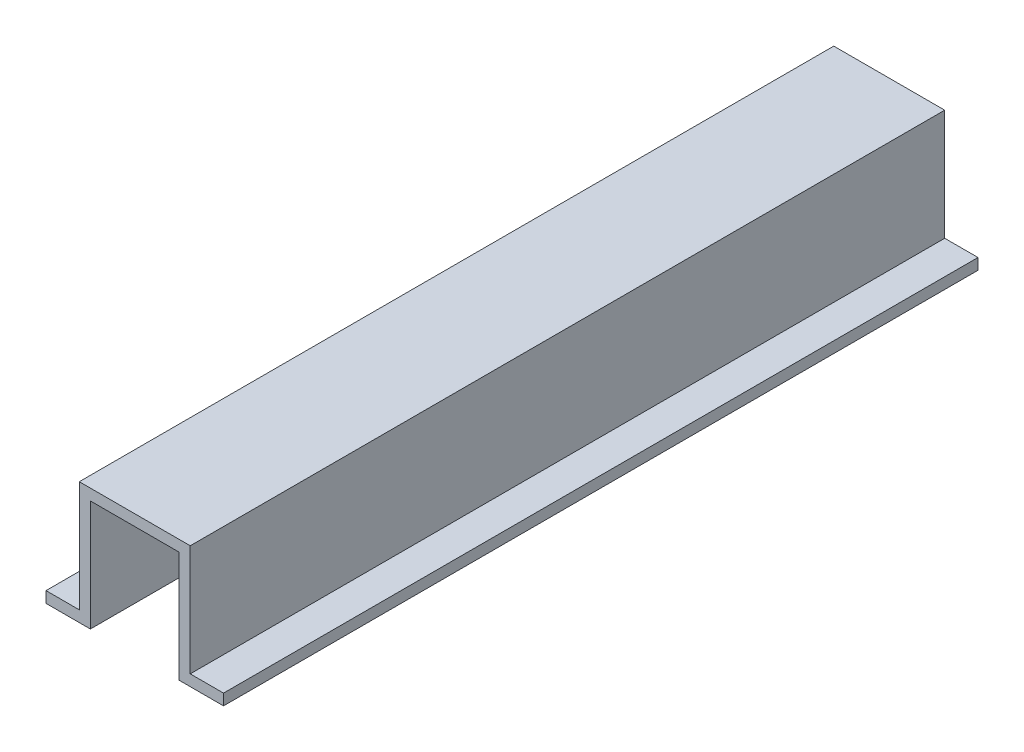
ISO-10303-21;
HEADER;
FILE_DESCRIPTION(('STEP AP214'),'2;1');
FILE_NAME('part.step','',(''),(''),'','','');
FILE_SCHEMA(('AUTOMOTIVE_DESIGN { 1 0 10303 214 1 1 1 1 }'));
ENDSEC;
DATA;
#1=APPLICATION_CONTEXT('core data for automotive mechanical design processes');
#2=APPLICATION_PROTOCOL_DEFINITION('international standard','automotive_design',2000,#1);
#3=PRODUCT_CONTEXT('',#1,'mechanical');
#4=PRODUCT('Part','Part','',(#3));
#5=PRODUCT_RELATED_PRODUCT_CATEGORY('part','',(#4));
#6=PRODUCT_DEFINITION_FORMATION('','',#4);
#7=PRODUCT_DEFINITION_CONTEXT('part definition',#1,'design');
#8=PRODUCT_DEFINITION('design','',#6,#7);
#9=PRODUCT_DEFINITION_SHAPE('','',#8);
#10=(LENGTH_UNIT() NAMED_UNIT(*) SI_UNIT(.MILLI.,.METRE.));
#11=(NAMED_UNIT(*) PLANE_ANGLE_UNIT() SI_UNIT($,.RADIAN.));
#12=(NAMED_UNIT(*) SI_UNIT($,.STERADIAN.) SOLID_ANGLE_UNIT());
#13=UNCERTAINTY_MEASURE_WITH_UNIT(LENGTH_MEASURE(1.E-05),#10,'distance_accuracy_value','');
#14=(GEOMETRIC_REPRESENTATION_CONTEXT(3) GLOBAL_UNCERTAINTY_ASSIGNED_CONTEXT((#13)) GLOBAL_UNIT_ASSIGNED_CONTEXT((#10,
#11,#12)) REPRESENTATION_CONTEXT('',''));
#15=CARTESIAN_POINT('',(0.,0.,0.));
#16=DIRECTION('',(0.,0.,1.));
#17=DIRECTION('',(1.,0.,0.));
#18=AXIS2_PLACEMENT_3D('',#15,#16,#17);
#19=CARTESIAN_POINT('',(-8.,8.,68.));
#20=DIRECTION('',(1.,0.,0.));
#21=DIRECTION('',(0.,0.,-1.));
#22=AXIS2_PLACEMENT_3D('',#19,#20,#21);
#23=PLANE('',#22);
#24=DIRECTION('',(0.,-1.,0.));
#25=VECTOR('',#24,1.);
#26=CARTESIAN_POINT('',(-8.,8.,0.));
#27=LINE('',#26,#25);
#28=CARTESIAN_POINT('',(-8.,8.,0.));
#29=VERTEX_POINT('',#28);
#30=CARTESIAN_POINT('',(-8.,7.,0.));
#31=VERTEX_POINT('',#30);
#32=EDGE_CURVE('E172',#29,#31,#27,.T.);
#33=ORIENTED_EDGE('',*,*,#32,.T.);
#34=DIRECTION('',(0.,0.,-1.));
#35=VECTOR('',#34,1.);
#36=CARTESIAN_POINT('',(-8.,7.,68.));
#37=LINE('',#36,#35);
#38=CARTESIAN_POINT('',(-8.,7.,68.));
#39=VERTEX_POINT('',#38);
#40=EDGE_CURVE('E11',#39,#31,#37,.T.);
#41=ORIENTED_EDGE('',*,*,#40,.F.);
#42=DIRECTION('',(0.,-1.,0.));
#43=VECTOR('',#42,1.);
#44=CARTESIAN_POINT('',(-8.,8.,68.));
#45=LINE('',#44,#43);
#46=CARTESIAN_POINT('',(-8.,8.,68.));
#47=VERTEX_POINT('',#46);
#48=EDGE_CURVE('E206',#47,#39,#45,.T.);
#49=ORIENTED_EDGE('',*,*,#48,.F.);
#50=DIRECTION('',(0.,0.,-1.));
#51=VECTOR('',#50,1.);
#52=CARTESIAN_POINT('',(-8.,8.,68.));
#53=LINE('',#52,#51);
#54=EDGE_CURVE('E168',#47,#29,#53,.T.);
#55=ORIENTED_EDGE('',*,*,#54,.T.);
#56=EDGE_LOOP('',(#33,#41,#49,#55));
#57=FACE_BOUND('',#56,.T.);
#58=ADVANCED_FACE('F45',(#57),#23,.F.);
#59=CARTESIAN_POINT('',(-8.,7.,68.));
#60=DIRECTION('',(0.,1.,0.));
#61=DIRECTION('',(0.,0.,1.));
#62=AXIS2_PLACEMENT_3D('',#59,#60,#61);
#63=PLANE('',#62);
#64=DIRECTION('',(1.,0.,0.));
#65=VECTOR('',#64,1.);
#66=CARTESIAN_POINT('',(-8.,7.,0.));
#67=LINE('',#66,#65);
#68=CARTESIAN_POINT('',(-4.,7.,0.));
#69=VERTEX_POINT('',#68);
#70=EDGE_CURVE('E176',#31,#69,#67,.T.);
#71=ORIENTED_EDGE('',*,*,#70,.T.);
#72=DIRECTION('',(0.,0.,-1.));
#73=VECTOR('',#72,1.);
#74=CARTESIAN_POINT('',(-4.,7.,68.));
#75=LINE('',#74,#73);
#76=CARTESIAN_POINT('',(-4.,7.,68.));
#77=VERTEX_POINT('',#76);
#78=EDGE_CURVE('E54',#77,#69,#75,.T.);
#79=ORIENTED_EDGE('',*,*,#78,.F.);
#80=DIRECTION('',(1.,0.,0.));
#81=VECTOR('',#80,1.);
#82=CARTESIAN_POINT('',(-8.,7.,68.));
#83=LINE('',#82,#81);
#84=EDGE_CURVE('E117',#39,#77,#83,.T.);
#85=ORIENTED_EDGE('',*,*,#84,.F.);
#86=ORIENTED_EDGE('',*,*,#40,.T.);
#87=EDGE_LOOP('',(#71,#79,#85,#86));
#88=FACE_BOUND('',#87,.T.);
#89=ADVANCED_FACE('F282',(#88),#63,.F.);
#90=CARTESIAN_POINT('',(-4.,7.,68.));
#91=DIRECTION('',(-1.,0.,0.));
#92=DIRECTION('',(0.,0.,1.));
#93=AXIS2_PLACEMENT_3D('',#90,#91,#92);
#94=PLANE('',#93);
#95=DIRECTION('',(0.,1.,0.));
#96=VECTOR('',#95,1.);
#97=CARTESIAN_POINT('',(-4.,7.,0.));
#98=LINE('',#97,#96);
#99=CARTESIAN_POINT('',(-4.,17.,0.));
#100=VERTEX_POINT('',#99);
#101=EDGE_CURVE('E179',#69,#100,#98,.T.);
#102=ORIENTED_EDGE('',*,*,#101,.T.);
#103=DIRECTION('',(0.,0.,-1.));
#104=VECTOR('',#103,1.);
#105=CARTESIAN_POINT('',(-4.,17.,68.));
#106=LINE('',#105,#104);
#107=CARTESIAN_POINT('',(-4.,17.,68.));
#108=VERTEX_POINT('',#107);
#109=EDGE_CURVE('E231',#108,#100,#106,.T.);
#110=ORIENTED_EDGE('',*,*,#109,.F.);
#111=DIRECTION('',(0.,1.,0.));
#112=VECTOR('',#111,1.);
#113=CARTESIAN_POINT('',(-4.,7.,68.));
#114=LINE('',#113,#112);
#115=EDGE_CURVE('E241',#77,#108,#114,.T.);
#116=ORIENTED_EDGE('',*,*,#115,.F.);
#117=ORIENTED_EDGE('',*,*,#78,.T.);
#118=EDGE_LOOP('',(#102,#110,#116,#117));
#119=FACE_BOUND('',#118,.T.);
#120=ADVANCED_FACE('F239',(#119),#94,.F.);
#121=CARTESIAN_POINT('',(-4.,17.,68.));
#122=DIRECTION('',(0.,1.,0.));
#123=DIRECTION('',(0.,0.,1.));
#124=AXIS2_PLACEMENT_3D('',#121,#122,#123);
#125=PLANE('',#124);
#126=DIRECTION('',(1.,0.,0.));
#127=VECTOR('',#126,1.);
#128=CARTESIAN_POINT('',(-4.,17.,0.));
#129=LINE('',#128,#127);
#130=CARTESIAN_POINT('',(4.,17.,0.));
#131=VERTEX_POINT('',#130);
#132=EDGE_CURVE('E182',#100,#131,#129,.T.);
#133=ORIENTED_EDGE('',*,*,#132,.T.);
#134=DIRECTION('',(0.,0.,-1.));
#135=VECTOR('',#134,1.);
#136=CARTESIAN_POINT('',(4.,17.,68.));
#137=LINE('',#136,#135);
#138=CARTESIAN_POINT('',(4.,17.,68.));
#139=VERTEX_POINT('',#138);
#140=EDGE_CURVE('E227',#139,#131,#137,.T.);
#141=ORIENTED_EDGE('',*,*,#140,.F.);
#142=DIRECTION('',(1.,0.,0.));
#143=VECTOR('',#142,1.);
#144=CARTESIAN_POINT('',(-4.,17.,68.));
#145=LINE('',#144,#143);
#146=EDGE_CURVE('E260',#108,#139,#145,.T.);
#147=ORIENTED_EDGE('',*,*,#146,.F.);
#148=ORIENTED_EDGE('',*,*,#109,.T.);
#149=EDGE_LOOP('',(#133,#141,#147,#148));
#150=FACE_BOUND('',#149,.T.);
#151=ADVANCED_FACE('F250',(#150),#125,.F.);
#152=CARTESIAN_POINT('',(4.,17.,68.));
#153=DIRECTION('',(1.,0.,0.));
#154=DIRECTION('',(0.,0.,-1.));
#155=AXIS2_PLACEMENT_3D('',#152,#153,#154);
#156=PLANE('',#155);
#157=DIRECTION('',(0.,-1.,0.));
#158=VECTOR('',#157,1.);
#159=CARTESIAN_POINT('',(4.,17.,0.));
#160=LINE('',#159,#158);
#161=CARTESIAN_POINT('',(4.,7.,0.));
#162=VERTEX_POINT('',#161);
#163=EDGE_CURVE('E185',#131,#162,#160,.T.);
#164=ORIENTED_EDGE('',*,*,#163,.T.);
#165=DIRECTION('',(0.,0.,-1.));
#166=VECTOR('',#165,1.);
#167=CARTESIAN_POINT('',(4.,7.,68.));
#168=LINE('',#167,#166);
#169=CARTESIAN_POINT('',(4.,7.,68.));
#170=VERTEX_POINT('',#169);
#171=EDGE_CURVE('E223',#170,#162,#168,.T.);
#172=ORIENTED_EDGE('',*,*,#171,.F.);
#173=DIRECTION('',(0.,-1.,0.));
#174=VECTOR('',#173,1.);
#175=CARTESIAN_POINT('',(4.,17.,68.));
#176=LINE('',#175,#174);
#177=EDGE_CURVE('E256',#139,#170,#176,.T.);
#178=ORIENTED_EDGE('',*,*,#177,.F.);
#179=ORIENTED_EDGE('',*,*,#140,.T.);
#180=EDGE_LOOP('',(#164,#172,#178,#179));
#181=FACE_BOUND('',#180,.T.);
#182=ADVANCED_FACE('F254',(#181),#156,.F.);
#183=CARTESIAN_POINT('',(4.,7.,68.));
#184=DIRECTION('',(0.,1.,0.));
#185=DIRECTION('',(0.,0.,1.));
#186=AXIS2_PLACEMENT_3D('',#183,#184,#185);
#187=PLANE('',#186);
#188=DIRECTION('',(1.,0.,0.));
#189=VECTOR('',#188,1.);
#190=CARTESIAN_POINT('',(4.,7.,0.));
#191=LINE('',#190,#189);
#192=CARTESIAN_POINT('',(8.,7.,0.));
#193=VERTEX_POINT('',#192);
#194=EDGE_CURVE('E188',#162,#193,#191,.T.);
#195=ORIENTED_EDGE('',*,*,#194,.T.);
#196=DIRECTION('',(0.,0.,-1.));
#197=VECTOR('',#196,1.);
#198=CARTESIAN_POINT('',(8.,7.,68.));
#199=LINE('',#198,#197);
#200=CARTESIAN_POINT('',(8.,7.,68.));
#201=VERTEX_POINT('',#200);
#202=EDGE_CURVE('E219',#201,#193,#199,.T.);
#203=ORIENTED_EDGE('',*,*,#202,.F.);
#204=DIRECTION('',(1.,0.,0.));
#205=VECTOR('',#204,1.);
#206=CARTESIAN_POINT('',(4.,7.,68.));
#207=LINE('',#206,#205);
#208=EDGE_CURVE('E259',#170,#201,#207,.T.);
#209=ORIENTED_EDGE('',*,*,#208,.F.);
#210=ORIENTED_EDGE('',*,*,#171,.T.);
#211=EDGE_LOOP('',(#195,#203,#209,#210));
#212=FACE_BOUND('',#211,.T.);
#213=ADVANCED_FACE('F293',(#212),#187,.F.);
#214=CARTESIAN_POINT('',(8.,7.,68.));
#215=DIRECTION('',(-1.,0.,0.));
#216=DIRECTION('',(0.,0.,1.));
#217=AXIS2_PLACEMENT_3D('',#214,#215,#216);
#218=PLANE('',#217);
#219=DIRECTION('',(0.,1.,0.));
#220=VECTOR('',#219,1.);
#221=CARTESIAN_POINT('',(8.,7.,0.));
#222=LINE('',#221,#220);
#223=CARTESIAN_POINT('',(8.,8.,0.));
#224=VERTEX_POINT('',#223);
#225=EDGE_CURVE('E191',#193,#224,#222,.T.);
#226=ORIENTED_EDGE('',*,*,#225,.T.);
#227=DIRECTION('',(0.,0.,-1.));
#228=VECTOR('',#227,1.);
#229=CARTESIAN_POINT('',(8.,8.,68.));
#230=LINE('',#229,#228);
#231=CARTESIAN_POINT('',(8.,8.,68.));
#232=VERTEX_POINT('',#231);
#233=EDGE_CURVE('E215',#232,#224,#230,.T.);
#234=ORIENTED_EDGE('',*,*,#233,.F.);
#235=DIRECTION('',(0.,1.,0.));
#236=VECTOR('',#235,1.);
#237=CARTESIAN_POINT('',(8.,7.,68.));
#238=LINE('',#237,#236);
#239=EDGE_CURVE('E263',#201,#232,#238,.T.);
#240=ORIENTED_EDGE('',*,*,#239,.F.);
#241=ORIENTED_EDGE('',*,*,#202,.T.);
#242=EDGE_LOOP('',(#226,#234,#240,#241));
#243=FACE_BOUND('',#242,.T.);
#244=ADVANCED_FACE('F296',(#243),#218,.F.);
#245=CARTESIAN_POINT('',(8.,8.,68.));
#246=DIRECTION('',(0.,-1.,0.));
#247=DIRECTION('',(0.,0.,-1.));
#248=AXIS2_PLACEMENT_3D('',#245,#246,#247);
#249=PLANE('',#248);
#250=DIRECTION('',(-1.,0.,0.));
#251=VECTOR('',#250,1.);
#252=CARTESIAN_POINT('',(8.,8.,0.));
#253=LINE('',#252,#251);
#254=CARTESIAN_POINT('',(5.,8.,0.));
#255=VERTEX_POINT('',#254);
#256=EDGE_CURVE('E194',#224,#255,#253,.T.);
#257=ORIENTED_EDGE('',*,*,#256,.T.);
#258=DIRECTION('',(0.,0.,-1.));
#259=VECTOR('',#258,1.);
#260=CARTESIAN_POINT('',(5.,8.,68.));
#261=LINE('',#260,#259);
#262=CARTESIAN_POINT('',(5.,8.,68.));
#263=VERTEX_POINT('',#262);
#264=EDGE_CURVE('E212',#263,#255,#261,.T.);
#265=ORIENTED_EDGE('',*,*,#264,.F.);
#266=DIRECTION('',(-1.,0.,0.));
#267=VECTOR('',#266,1.);
#268=CARTESIAN_POINT('',(8.,8.,68.));
#269=LINE('',#268,#267);
#270=EDGE_CURVE('E271',#232,#263,#269,.T.);
#271=ORIENTED_EDGE('',*,*,#270,.F.);
#272=ORIENTED_EDGE('',*,*,#233,.T.);
#273=EDGE_LOOP('',(#257,#265,#271,#272));
#274=FACE_BOUND('',#273,.T.);
#275=ADVANCED_FACE('F300',(#274),#249,.F.);
#276=CARTESIAN_POINT('',(5.,8.,68.));
#277=DIRECTION('',(-1.,0.,0.));
#278=DIRECTION('',(0.,0.,1.));
#279=AXIS2_PLACEMENT_3D('',#276,#277,#278);
#280=PLANE('',#279);
#281=DIRECTION('',(0.,1.,0.));
#282=VECTOR('',#281,1.);
#283=CARTESIAN_POINT('',(5.,8.,0.));
#284=LINE('',#283,#282);
#285=CARTESIAN_POINT('',(5.,18.,0.));
#286=VERTEX_POINT('',#285);
#287=EDGE_CURVE('E197',#255,#286,#284,.T.);
#288=ORIENTED_EDGE('',*,*,#287,.T.);
#289=DIRECTION('',(0.,0.,-1.));
#290=VECTOR('',#289,1.);
#291=CARTESIAN_POINT('',(5.,18.,68.));
#292=LINE('',#291,#290);
#293=CARTESIAN_POINT('',(5.,18.,68.));
#294=VERTEX_POINT('',#293);
#295=EDGE_CURVE('E159',#294,#286,#292,.T.);
#296=ORIENTED_EDGE('',*,*,#295,.F.);
#297=DIRECTION('',(0.,1.,0.));
#298=VECTOR('',#297,1.);
#299=CARTESIAN_POINT('',(5.,8.,68.));
#300=LINE('',#299,#298);
#301=EDGE_CURVE('E148',#263,#294,#300,.T.);
#302=ORIENTED_EDGE('',*,*,#301,.F.);
#303=ORIENTED_EDGE('',*,*,#264,.T.);
#304=EDGE_LOOP('',(#288,#296,#302,#303));
#305=FACE_BOUND('',#304,.T.);
#306=ADVANCED_FACE('F304',(#305),#280,.F.);
#307=CARTESIAN_POINT('',(5.,18.,68.));
#308=DIRECTION('',(0.,-1.,0.));
#309=DIRECTION('',(0.,0.,-1.));
#310=AXIS2_PLACEMENT_3D('',#307,#308,#309);
#311=PLANE('',#310);
#312=DIRECTION('',(-1.,0.,0.));
#313=VECTOR('',#312,1.);
#314=CARTESIAN_POINT('',(5.,18.,0.));
#315=LINE('',#314,#313);
#316=CARTESIAN_POINT('',(-5.,18.,0.));
#317=VERTEX_POINT('',#316);
#318=EDGE_CURVE('E157',#286,#317,#315,.T.);
#319=ORIENTED_EDGE('',*,*,#318,.T.);
#320=DIRECTION('',(0.,0.,-1.));
#321=VECTOR('',#320,1.);
#322=CARTESIAN_POINT('',(-5.,18.,68.));
#323=LINE('',#322,#321);
#324=CARTESIAN_POINT('',(-5.,18.,68.));
#325=VERTEX_POINT('',#324);
#326=EDGE_CURVE('E154',#325,#317,#323,.T.);
#327=ORIENTED_EDGE('',*,*,#326,.F.);
#328=DIRECTION('',(-1.,0.,0.));
#329=VECTOR('',#328,1.);
#330=CARTESIAN_POINT('',(5.,18.,68.));
#331=LINE('',#330,#329);
#332=EDGE_CURVE('E142',#294,#325,#331,.T.);
#333=ORIENTED_EDGE('',*,*,#332,.F.);
#334=ORIENTED_EDGE('',*,*,#295,.T.);
#335=EDGE_LOOP('',(#319,#327,#333,#334));
#336=FACE_BOUND('',#335,.T.);
#337=ADVANCED_FACE('F155',(#336),#311,.F.);
#338=CARTESIAN_POINT('',(-5.,18.,68.));
#339=DIRECTION('',(1.,0.,0.));
#340=DIRECTION('',(0.,0.,-1.));
#341=AXIS2_PLACEMENT_3D('',#338,#339,#340);
#342=PLANE('',#341);
#343=DIRECTION('',(0.,-1.,0.));
#344=VECTOR('',#343,1.);
#345=CARTESIAN_POINT('',(-5.,18.,0.));
#346=LINE('',#345,#344);
#347=CARTESIAN_POINT('',(-5.,8.,0.));
#348=VERTEX_POINT('',#347);
#349=EDGE_CURVE('E103',#317,#348,#346,.T.);
#350=ORIENTED_EDGE('',*,*,#349,.T.);
#351=DIRECTION('',(0.,0.,-1.));
#352=VECTOR('',#351,1.);
#353=CARTESIAN_POINT('',(-5.,8.,68.));
#354=LINE('',#353,#352);
#355=CARTESIAN_POINT('',(-5.,8.,68.));
#356=VERTEX_POINT('',#355);
#357=EDGE_CURVE('E160',#356,#348,#354,.T.);
#358=ORIENTED_EDGE('',*,*,#357,.F.);
#359=DIRECTION('',(0.,-1.,0.));
#360=VECTOR('',#359,1.);
#361=CARTESIAN_POINT('',(-5.,18.,68.));
#362=LINE('',#361,#360);
#363=EDGE_CURVE('E146',#325,#356,#362,.T.);
#364=ORIENTED_EDGE('',*,*,#363,.F.);
#365=ORIENTED_EDGE('',*,*,#326,.T.);
#366=EDGE_LOOP('',(#350,#358,#364,#365));
#367=FACE_BOUND('',#366,.T.);
#368=ADVANCED_FACE('F162',(#367),#342,.F.);
#369=CARTESIAN_POINT('',(-5.,8.,68.));
#370=DIRECTION('',(0.,-1.,0.));
#371=DIRECTION('',(0.,0.,-1.));
#372=AXIS2_PLACEMENT_3D('',#369,#370,#371);
#373=PLANE('',#372);
#374=DIRECTION('',(-1.,0.,0.));
#375=VECTOR('',#374,1.);
#376=CARTESIAN_POINT('',(-5.,8.,0.));
#377=LINE('',#376,#375);
#378=EDGE_CURVE('E109',#348,#29,#377,.T.);
#379=ORIENTED_EDGE('',*,*,#378,.T.);
#380=ORIENTED_EDGE('',*,*,#54,.F.);
#381=DIRECTION('',(-1.,0.,0.));
#382=VECTOR('',#381,1.);
#383=CARTESIAN_POINT('',(-5.,8.,68.));
#384=LINE('',#383,#382);
#385=EDGE_CURVE('E62',#356,#47,#384,.T.);
#386=ORIENTED_EDGE('',*,*,#385,.F.);
#387=ORIENTED_EDGE('',*,*,#357,.T.);
#388=EDGE_LOOP('',(#379,#380,#386,#387));
#389=FACE_BOUND('',#388,.T.);
#390=ADVANCED_FACE('F313',(#389),#373,.F.);
#391=CARTESIAN_POINT('',(0.,0.,68.));
#392=DIRECTION('',(0.,0.,1.));
#393=DIRECTION('',(1.,0.,0.));
#394=AXIS2_PLACEMENT_3D('',#391,#392,#393);
#395=PLANE('',#394);
#396=ORIENTED_EDGE('',*,*,#48,.T.);
#397=ORIENTED_EDGE('',*,*,#84,.T.);
#398=ORIENTED_EDGE('',*,*,#115,.T.);
#399=ORIENTED_EDGE('',*,*,#146,.T.);
#400=ORIENTED_EDGE('',*,*,#177,.T.);
#401=ORIENTED_EDGE('',*,*,#208,.T.);
#402=ORIENTED_EDGE('',*,*,#239,.T.);
#403=ORIENTED_EDGE('',*,*,#270,.T.);
#404=ORIENTED_EDGE('',*,*,#301,.T.);
#405=ORIENTED_EDGE('',*,*,#332,.T.);
#406=ORIENTED_EDGE('',*,*,#363,.T.);
#407=ORIENTED_EDGE('',*,*,#385,.T.);
#408=EDGE_LOOP('',(#396,#397,#398,#399,#400,#401,#402,#403,#404,#405,#406,#407));
#409=FACE_BOUND('',#408,.T.);
#410=ADVANCED_FACE('F144',(#409),#395,.T.);
#411=CARTESIAN_POINT('',(0.,0.,0.));
#412=DIRECTION('',(0.,0.,1.));
#413=DIRECTION('',(1.,0.,0.));
#414=AXIS2_PLACEMENT_3D('',#411,#412,#413);
#415=PLANE('',#414);
#416=ORIENTED_EDGE('',*,*,#32,.F.);
#417=ORIENTED_EDGE('',*,*,#378,.F.);
#418=ORIENTED_EDGE('',*,*,#349,.F.);
#419=ORIENTED_EDGE('',*,*,#318,.F.);
#420=ORIENTED_EDGE('',*,*,#287,.F.);
#421=ORIENTED_EDGE('',*,*,#256,.F.);
#422=ORIENTED_EDGE('',*,*,#225,.F.);
#423=ORIENTED_EDGE('',*,*,#194,.F.);
#424=ORIENTED_EDGE('',*,*,#163,.F.);
#425=ORIENTED_EDGE('',*,*,#132,.F.);
#426=ORIENTED_EDGE('',*,*,#101,.F.);
#427=ORIENTED_EDGE('',*,*,#70,.F.);
#428=EDGE_LOOP('',(#416,#417,#418,#419,#420,#421,#422,#423,#424,#425,#426,#427));
#429=FACE_BOUND('',#428,.T.);
#430=ADVANCED_FACE('F245',(#429),#415,.F.);
#431=CLOSED_SHELL('',(#58,#89,#120,#151,#182,#213,#244,#275,#306,#337,#368,#390,#410,#430));
#432=MANIFOLD_SOLID_BREP('B2',#431);
#433=ADVANCED_BREP_SHAPE_REPRESENTATION('',(#18,#432),#14);
#434=SHAPE_DEFINITION_REPRESENTATION(#9,#433);
ENDSEC;
END-ISO-10303-21;
